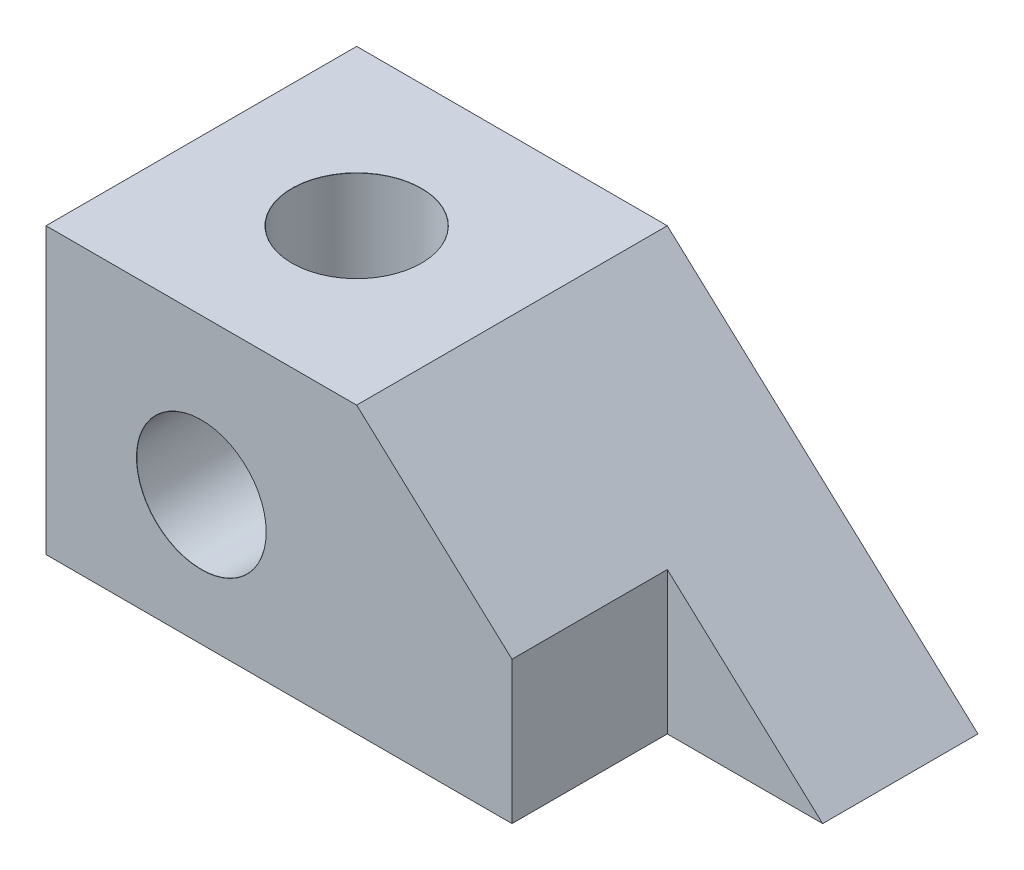
ISO-10303-21;
HEADER;
FILE_DESCRIPTION(('STEP AP214'),'2;1');
FILE_NAME('part.step','',(''),(''),'','','');
FILE_SCHEMA(('AUTOMOTIVE_DESIGN { 1 0 10303 214 1 1 1 1 }'));
ENDSEC;
DATA;
#1=APPLICATION_CONTEXT('core data for automotive mechanical design processes');
#2=APPLICATION_PROTOCOL_DEFINITION('international standard','automotive_design',2000,#1);
#3=PRODUCT_CONTEXT('',#1,'mechanical');
#4=PRODUCT('Part','Part','',(#3));
#5=PRODUCT_RELATED_PRODUCT_CATEGORY('part','',(#4));
#6=PRODUCT_DEFINITION_FORMATION('','',#4);
#7=PRODUCT_DEFINITION_CONTEXT('part definition',#1,'design');
#8=PRODUCT_DEFINITION('design','',#6,#7);
#9=PRODUCT_DEFINITION_SHAPE('','',#8);
#10=(LENGTH_UNIT() NAMED_UNIT(*) SI_UNIT(.MILLI.,.METRE.));
#11=(NAMED_UNIT(*) PLANE_ANGLE_UNIT() SI_UNIT($,.RADIAN.));
#12=(NAMED_UNIT(*) SI_UNIT($,.STERADIAN.) SOLID_ANGLE_UNIT());
#13=UNCERTAINTY_MEASURE_WITH_UNIT(LENGTH_MEASURE(1.E-05),#10,'distance_accuracy_value','');
#14=(GEOMETRIC_REPRESENTATION_CONTEXT(3) GLOBAL_UNCERTAINTY_ASSIGNED_CONTEXT((#13)) GLOBAL_UNIT_ASSIGNED_CONTEXT((#10,
#11,#12)) REPRESENTATION_CONTEXT('',''));
#15=CARTESIAN_POINT('',(0.,0.,0.));
#16=DIRECTION('',(0.,0.,1.));
#17=DIRECTION('',(1.,0.,0.));
#18=AXIS2_PLACEMENT_3D('',#15,#16,#17);
#19=CARTESIAN_POINT('',(30.,25.,0.));
#20=DIRECTION('',(0.,0.,1.));
#21=DIRECTION('',(1.,0.,0.));
#22=AXIS2_PLACEMENT_3D('',#19,#20,#21);
#23=CYLINDRICAL_SURFACE('',#22,12.5);
#24=CARTESIAN_POINT('',(30.,25.,-0.025000000000025));
#25=DIRECTION('',(0.,0.,1.));
#26=DIRECTION('',(1.,0.,0.));
#27=AXIS2_PLACEMENT_3D('',#24,#25,#26);
#28=CIRCLE('',#27,12.5);
#29=CARTESIAN_POINT('',(42.5,25.,-0.025000000000025));
#30=VERTEX_POINT('',#29);
#31=EDGE_CURVE('E244',#30,#30,#28,.T.);
#32=ORIENTED_EDGE('',*,*,#31,.T.);
#33=EDGE_LOOP('',(#32));
#34=FACE_BOUND('',#33,.T.);
#35=CARTESIAN_POINT('',(30.,25.,-30.));
#36=DIRECTION('',(0.,-0.707106781186547,0.707106781186547));
#37=DIRECTION('',(0.,0.707106781186547,0.707106781186547));
#38=AXIS2_PLACEMENT_3D('',#35,#36,#37);
#39=ELLIPSE('',#38,17.6776695296637,12.5);
#40=CARTESIAN_POINT('',(17.5,25.,-30.));
#41=VERTEX_POINT('',#40);
#42=CARTESIAN_POINT('',(42.5,25.,-30.));
#43=VERTEX_POINT('',#42);
#44=EDGE_CURVE('E53',#41,#43,#39,.F.);
#45=ORIENTED_EDGE('',*,*,#44,.T.);
#46=CARTESIAN_POINT('',(30.,25.,-30.));
#47=DIRECTION('',(0.,0.707106781186547,0.707106781186547));
#48=DIRECTION('',(0.,-0.707106781186547,0.707106781186547));
#49=AXIS2_PLACEMENT_3D('',#46,#47,#48);
#50=ELLIPSE('',#49,17.6776695296637,12.5);
#51=EDGE_CURVE('E11',#43,#41,#50,.F.);
#52=ORIENTED_EDGE('',*,*,#51,.T.);
#53=EDGE_LOOP('',(#45,#52));
#54=FACE_BOUND('',#53,.T.);
#55=ADVANCED_FACE('F39',(#34,#54),#23,.F.);
#56=CARTESIAN_POINT('',(0.,55.,0.));
#57=DIRECTION('',(1.,0.,0.));
#58=DIRECTION('',(0.,0.,-1.));
#59=AXIS2_PLACEMENT_3D('',#56,#57,#58);
#60=PLANE('',#59);
#61=DIRECTION('',(0.,0.,1.));
#62=VECTOR('',#61,1.);
#63=CARTESIAN_POINT('',(0.,0.,0.));
#64=LINE('',#63,#62);
#65=CARTESIAN_POINT('',(0.,0.,-60.));
#66=VERTEX_POINT('',#65);
#67=CARTESIAN_POINT('',(0.,0.,0.));
#68=VERTEX_POINT('',#67);
#69=EDGE_CURVE('E103',#66,#68,#64,.T.);
#70=ORIENTED_EDGE('',*,*,#69,.T.);
#71=DIRECTION('',(0.,-1.,0.));
#72=VECTOR('',#71,1.);
#73=CARTESIAN_POINT('',(0.,55.,0.));
#74=LINE('',#73,#72);
#75=CARTESIAN_POINT('',(0.,55.,0.));
#76=VERTEX_POINT('',#75);
#77=EDGE_CURVE('E140',#76,#68,#74,.T.);
#78=ORIENTED_EDGE('',*,*,#77,.F.);
#79=DIRECTION('',(0.,0.,1.));
#80=VECTOR('',#79,1.);
#81=CARTESIAN_POINT('',(0.,55.,0.));
#82=LINE('',#81,#80);
#83=CARTESIAN_POINT('',(0.,55.,-60.));
#84=VERTEX_POINT('',#83);
#85=EDGE_CURVE('E97',#84,#76,#82,.T.);
#86=ORIENTED_EDGE('',*,*,#85,.F.);
#87=DIRECTION('',(0.,-1.,0.));
#88=VECTOR('',#87,1.);
#89=CARTESIAN_POINT('',(0.,55.,-60.));
#90=LINE('',#89,#88);
#91=EDGE_CURVE('E88',#84,#66,#90,.T.);
#92=ORIENTED_EDGE('',*,*,#91,.T.);
#93=EDGE_LOOP('',(#70,#78,#86,#92));
#94=FACE_BOUND('',#93,.T.);
#95=ADVANCED_FACE('F41',(#94),#60,.F.);
#96=CARTESIAN_POINT('',(0.,55.,0.));
#97=DIRECTION('',(0.,0.,-1.));
#98=DIRECTION('',(-1.,0.,0.));
#99=AXIS2_PLACEMENT_3D('',#96,#97,#98);
#100=PLANE('',#99);
#101=CARTESIAN_POINT('',(30.,25.,0.));
#102=DIRECTION('',(0.,0.,1.));
#103=DIRECTION('',(1.,0.,0.));
#104=AXIS2_PLACEMENT_3D('',#101,#102,#103);
#105=CIRCLE('',#104,12.525);
#106=CARTESIAN_POINT('',(42.525,25.,0.));
#107=VERTEX_POINT('',#106);
#108=EDGE_CURVE('E208',#107,#107,#105,.T.);
#109=ORIENTED_EDGE('',*,*,#108,.F.);
#110=EDGE_LOOP('',(#109));
#111=FACE_BOUND('',#110,.T.);
#112=DIRECTION('',(0.,-1.,0.));
#113=VECTOR('',#112,1.);
#114=CARTESIAN_POINT('',(90.,55.,0.));
#115=LINE('',#114,#113);
#116=CARTESIAN_POINT('',(90.,27.5,0.));
#117=VERTEX_POINT('',#116);
#118=CARTESIAN_POINT('',(90.,0.,0.));
#119=VERTEX_POINT('',#118);
#120=EDGE_CURVE('E137',#117,#119,#115,.T.);
#121=ORIENTED_EDGE('',*,*,#120,.F.);
#122=DIRECTION('',(0.737154140200741,-0.675724628517346,0.));
#123=VECTOR('',#122,1.);
#124=CARTESIAN_POINT('',(60.,55.,0.));
#125=LINE('',#124,#123);
#126=CARTESIAN_POINT('',(60.,55.,0.));
#127=VERTEX_POINT('',#126);
#128=EDGE_CURVE('E213',#127,#117,#125,.T.);
#129=ORIENTED_EDGE('',*,*,#128,.F.);
#130=DIRECTION('',(1.,0.,0.));
#131=VECTOR('',#130,1.);
#132=CARTESIAN_POINT('',(0.,55.,0.));
#133=LINE('',#132,#131);
#134=EDGE_CURVE('E229',#76,#127,#133,.T.);
#135=ORIENTED_EDGE('',*,*,#134,.F.);
#136=ORIENTED_EDGE('',*,*,#77,.T.);
#137=DIRECTION('',(1.,0.,0.));
#138=VECTOR('',#137,1.);
#139=CARTESIAN_POINT('',(0.,0.,0.));
#140=LINE('',#139,#138);
#141=EDGE_CURVE('E110',#68,#119,#140,.T.);
#142=ORIENTED_EDGE('',*,*,#141,.T.);
#143=EDGE_LOOP('',(#121,#129,#135,#136,#142));
#144=FACE_BOUND('',#143,.T.);
#145=ADVANCED_FACE('F168',(#111,#144),#100,.F.);
#146=CARTESIAN_POINT('',(90.,55.,0.));
#147=DIRECTION('',(-1.,0.,0.));
#148=DIRECTION('',(0.,0.,1.));
#149=AXIS2_PLACEMENT_3D('',#146,#147,#148);
#150=PLANE('',#149);
#151=DIRECTION('',(0.,-1.,0.));
#152=VECTOR('',#151,1.);
#153=CARTESIAN_POINT('',(90.,55.,-30.));
#154=LINE('',#153,#152);
#155=CARTESIAN_POINT('',(90.,27.5,-30.));
#156=VERTEX_POINT('',#155);
#157=CARTESIAN_POINT('',(90.,0.,-30.));
#158=VERTEX_POINT('',#157);
#159=EDGE_CURVE('E105',#156,#158,#154,.T.);
#160=ORIENTED_EDGE('',*,*,#159,.F.);
#161=DIRECTION('',(0.,0.,1.));
#162=VECTOR('',#161,1.);
#163=CARTESIAN_POINT('',(90.,27.5,0.));
#164=LINE('',#163,#162);
#165=EDGE_CURVE('E113',#156,#117,#164,.T.);
#166=ORIENTED_EDGE('',*,*,#165,.T.);
#167=ORIENTED_EDGE('',*,*,#120,.T.);
#168=DIRECTION('',(0.,0.,-1.));
#169=VECTOR('',#168,1.);
#170=CARTESIAN_POINT('',(90.,0.,0.));
#171=LINE('',#170,#169);
#172=EDGE_CURVE('E117',#119,#158,#171,.T.);
#173=ORIENTED_EDGE('',*,*,#172,.T.);
#174=EDGE_LOOP('',(#160,#166,#167,#173));
#175=FACE_BOUND('',#174,.T.);
#176=ADVANCED_FACE('F197',(#175),#150,.F.);
#177=CARTESIAN_POINT('',(90.,55.,-30.));
#178=DIRECTION('',(0.,0.,-1.));
#179=DIRECTION('',(-1.,0.,0.));
#180=AXIS2_PLACEMENT_3D('',#177,#178,#179);
#181=PLANE('',#180);
#182=DIRECTION('',(1.,0.,0.));
#183=VECTOR('',#182,1.);
#184=CARTESIAN_POINT('',(90.,0.,-30.));
#185=LINE('',#184,#183);
#186=CARTESIAN_POINT('',(120.,0.,-30.));
#187=VERTEX_POINT('',#186);
#188=EDGE_CURVE('E128',#158,#187,#185,.T.);
#189=ORIENTED_EDGE('',*,*,#188,.T.);
#190=DIRECTION('',(-0.737154140200741,0.675724628517346,0.));
#191=VECTOR('',#190,1.);
#192=CARTESIAN_POINT('',(76.3018867924528,40.0566037735849,-30.));
#193=LINE('',#192,#191);
#194=EDGE_CURVE('E120',#187,#156,#193,.T.);
#195=ORIENTED_EDGE('',*,*,#194,.T.);
#196=ORIENTED_EDGE('',*,*,#159,.T.);
#197=EDGE_LOOP('',(#189,#195,#196));
#198=FACE_BOUND('',#197,.T.);
#199=ADVANCED_FACE('F193',(#198),#181,.F.);
#200=CARTESIAN_POINT('',(0.,55.,-60.));
#201=DIRECTION('',(0.,0.,1.));
#202=DIRECTION('',(1.,0.,0.));
#203=AXIS2_PLACEMENT_3D('',#200,#201,#202);
#204=PLANE('',#203);
#205=CARTESIAN_POINT('',(30.,25.,-60.));
#206=DIRECTION('',(0.,0.,1.));
#207=DIRECTION('',(1.,0.,0.));
#208=AXIS2_PLACEMENT_3D('',#205,#206,#207);
#209=CIRCLE('',#208,12.5);
#210=CARTESIAN_POINT('',(42.5,25.,-60.));
#211=VERTEX_POINT('',#210);
#212=EDGE_CURVE('E239',#211,#211,#209,.T.);
#213=ORIENTED_EDGE('',*,*,#212,.T.);
#214=EDGE_LOOP('',(#213));
#215=FACE_BOUND('',#214,.T.);
#216=DIRECTION('',(-1.,0.,0.));
#217=VECTOR('',#216,1.);
#218=CARTESIAN_POINT('',(102.487310380947,55.,-60.));
#219=LINE('',#218,#217);
#220=CARTESIAN_POINT('',(60.,55.,-60.));
#221=VERTEX_POINT('',#220);
#222=EDGE_CURVE('E62',#221,#84,#219,.T.);
#223=ORIENTED_EDGE('',*,*,#222,.F.);
#224=DIRECTION('',(0.737154140200741,-0.675724628517346,0.));
#225=VECTOR('',#224,1.);
#226=CARTESIAN_POINT('',(60.,55.,-60.));
#227=LINE('',#226,#225);
#228=CARTESIAN_POINT('',(120.,0.,-60.));
#229=VERTEX_POINT('',#228);
#230=EDGE_CURVE('E92',#221,#229,#227,.T.);
#231=ORIENTED_EDGE('',*,*,#230,.T.);
#232=DIRECTION('',(-1.,0.,0.));
#233=VECTOR('',#232,1.);
#234=CARTESIAN_POINT('',(0.,0.,-60.));
#235=LINE('',#234,#233);
#236=EDGE_CURVE('E85',#229,#66,#235,.T.);
#237=ORIENTED_EDGE('',*,*,#236,.T.);
#238=ORIENTED_EDGE('',*,*,#91,.F.);
#239=EDGE_LOOP('',(#223,#231,#237,#238));
#240=FACE_BOUND('',#239,.T.);
#241=ADVANCED_FACE('F87',(#215,#240),#204,.F.);
#242=CARTESIAN_POINT('',(0.,55.,0.));
#243=DIRECTION('',(0.,-1.,0.));
#244=DIRECTION('',(0.,0.,-1.));
#245=AXIS2_PLACEMENT_3D('',#242,#243,#244);
#246=PLANE('',#245);
#247=CARTESIAN_POINT('',(30.,55.,-30.));
#248=DIRECTION('',(0.,1.,0.));
#249=DIRECTION('',(0.,0.,1.));
#250=AXIS2_PLACEMENT_3D('',#247,#248,#249);
#251=CIRCLE('',#250,12.525);
#252=CARTESIAN_POINT('',(30.,55.,-17.475));
#253=VERTEX_POINT('',#252);
#254=EDGE_CURVE('E257',#253,#253,#251,.T.);
#255=ORIENTED_EDGE('',*,*,#254,.F.);
#256=EDGE_LOOP('',(#255));
#257=FACE_BOUND('',#256,.T.);
#258=ORIENTED_EDGE('',*,*,#134,.T.);
#259=DIRECTION('',(0.,0.,1.));
#260=VECTOR('',#259,1.);
#261=CARTESIAN_POINT('',(60.,55.,-60.));
#262=LINE('',#261,#260);
#263=EDGE_CURVE('E222',#221,#127,#262,.T.);
#264=ORIENTED_EDGE('',*,*,#263,.F.);
#265=ORIENTED_EDGE('',*,*,#222,.T.);
#266=ORIENTED_EDGE('',*,*,#85,.T.);
#267=EDGE_LOOP('',(#258,#264,#265,#266));
#268=FACE_BOUND('',#267,.T.);
#269=ADVANCED_FACE('F184',(#257,#268),#246,.F.);
#270=CARTESIAN_POINT('',(0.,0.,0.));
#271=DIRECTION('',(0.,-1.,0.));
#272=DIRECTION('',(0.,0.,-1.));
#273=AXIS2_PLACEMENT_3D('',#270,#271,#272);
#274=PLANE('',#273);
#275=CARTESIAN_POINT('',(30.,0.,-30.));
#276=DIRECTION('',(0.,1.,0.));
#277=DIRECTION('',(0.,0.,1.));
#278=AXIS2_PLACEMENT_3D('',#275,#276,#277);
#279=CIRCLE('',#278,12.5);
#280=CARTESIAN_POINT('',(30.,0.,-17.5));
#281=VERTEX_POINT('',#280);
#282=EDGE_CURVE('E249',#281,#281,#279,.T.);
#283=ORIENTED_EDGE('',*,*,#282,.T.);
#284=EDGE_LOOP('',(#283));
#285=FACE_BOUND('',#284,.T.);
#286=ORIENTED_EDGE('',*,*,#69,.F.);
#287=ORIENTED_EDGE('',*,*,#236,.F.);
#288=DIRECTION('',(0.,0.,-1.));
#289=VECTOR('',#288,1.);
#290=CARTESIAN_POINT('',(120.,0.,-60.));
#291=LINE('',#290,#289);
#292=EDGE_CURVE('E98',#187,#229,#291,.T.);
#293=ORIENTED_EDGE('',*,*,#292,.F.);
#294=ORIENTED_EDGE('',*,*,#188,.F.);
#295=ORIENTED_EDGE('',*,*,#172,.F.);
#296=ORIENTED_EDGE('',*,*,#141,.F.);
#297=EDGE_LOOP('',(#286,#287,#293,#294,#295,#296));
#298=FACE_BOUND('',#297,.T.);
#299=ADVANCED_FACE('F107',(#285,#298),#274,.T.);
#300=CARTESIAN_POINT('',(60.,55.,-60.));
#301=DIRECTION('',(-0.675724628517346,-0.737154140200741,0.));
#302=DIRECTION('',(0.737154140200741,-0.675724628517346,0.));
#303=AXIS2_PLACEMENT_3D('',#300,#301,#302);
#304=PLANE('',#303);
#305=ORIENTED_EDGE('',*,*,#194,.F.);
#306=ORIENTED_EDGE('',*,*,#292,.T.);
#307=ORIENTED_EDGE('',*,*,#230,.F.);
#308=ORIENTED_EDGE('',*,*,#263,.T.);
#309=ORIENTED_EDGE('',*,*,#128,.T.);
#310=ORIENTED_EDGE('',*,*,#165,.F.);
#311=EDGE_LOOP('',(#305,#306,#307,#308,#309,#310));
#312=FACE_BOUND('',#311,.T.);
#313=ADVANCED_FACE('F174',(#312),#304,.F.);
#314=CARTESIAN_POINT('',(30.,25.,-30.));
#315=DIRECTION('',(0.,-0.707106781186547,0.707106781186547));
#316=DIRECTION('',(0.,0.707106781186547,0.707106781186547));
#317=AXIS2_PLACEMENT_3D('',#314,#315,#316);
#318=ELLIPSE('',#317,17.6776695296637,12.5);
#319=EDGE_CURVE('E145',#41,#43,#318,.T.);
#320=ORIENTED_EDGE('',*,*,#319,.T.);
#321=CARTESIAN_POINT('',(30.,25.,-30.));
#322=DIRECTION('',(0.,0.707106781186547,0.707106781186547));
#323=DIRECTION('',(0.,-0.707106781186547,0.707106781186547));
#324=AXIS2_PLACEMENT_3D('',#321,#322,#323);
#325=ELLIPSE('',#324,17.6776695296637,12.5);
#326=EDGE_CURVE('E48',#43,#41,#325,.T.);
#327=ORIENTED_EDGE('',*,*,#326,.T.);
#328=EDGE_LOOP('',(#320,#327));
#329=FACE_BOUND('',#328,.T.);
#330=ORIENTED_EDGE('',*,*,#212,.F.);
#331=EDGE_LOOP('',(#330));
#332=FACE_BOUND('',#331,.T.);
#333=ADVANCED_FACE('F152',(#329,#332),#23,.F.);
#334=CARTESIAN_POINT('',(30.,25.,0.));
#335=DIRECTION('',(0.,0.,1.));
#336=DIRECTION('',(1.,0.,0.));
#337=AXIS2_PLACEMENT_3D('',#334,#335,#336);
#338=CONICAL_SURFACE('',#337,12.525,0.785398163397171);
#339=ORIENTED_EDGE('',*,*,#31,.F.);
#340=EDGE_LOOP('',(#339));
#341=FACE_BOUND('',#340,.T.);
#342=ORIENTED_EDGE('',*,*,#108,.T.);
#343=EDGE_LOOP('',(#342));
#344=FACE_BOUND('',#343,.T.);
#345=ADVANCED_FACE('F173',(#341,#344),#338,.F.);
#346=CARTESIAN_POINT('',(30.,55.,-30.));
#347=DIRECTION('',(0.,1.,0.));
#348=DIRECTION('',(0.,0.,1.));
#349=AXIS2_PLACEMENT_3D('',#346,#347,#348);
#350=CYLINDRICAL_SURFACE('',#349,12.5);
#351=CARTESIAN_POINT('',(30.,54.975,-30.));
#352=DIRECTION('',(0.,1.,0.));
#353=DIRECTION('',(0.,0.,1.));
#354=AXIS2_PLACEMENT_3D('',#351,#352,#353);
#355=CIRCLE('',#354,12.5);
#356=CARTESIAN_POINT('',(30.,54.975,-17.5));
#357=VERTEX_POINT('',#356);
#358=EDGE_CURVE('E253',#357,#357,#355,.T.);
#359=ORIENTED_EDGE('',*,*,#358,.T.);
#360=EDGE_LOOP('',(#359));
#361=FACE_BOUND('',#360,.T.);
#362=ORIENTED_EDGE('',*,*,#44,.F.);
#363=ORIENTED_EDGE('',*,*,#326,.F.);
#364=EDGE_LOOP('',(#362,#363));
#365=FACE_BOUND('',#364,.T.);
#366=ADVANCED_FACE('F159',(#361,#365),#350,.F.);
#367=CARTESIAN_POINT('',(30.,55.,-30.));
#368=DIRECTION('',(0.,1.,0.));
#369=DIRECTION('',(0.,0.,1.));
#370=AXIS2_PLACEMENT_3D('',#367,#368,#369);
#371=CONICAL_SURFACE('',#370,12.525,0.785398163397171);
#372=ORIENTED_EDGE('',*,*,#358,.F.);
#373=EDGE_LOOP('',(#372));
#374=FACE_BOUND('',#373,.T.);
#375=ORIENTED_EDGE('',*,*,#254,.T.);
#376=EDGE_LOOP('',(#375));
#377=FACE_BOUND('',#376,.T.);
#378=ADVANCED_FACE('F262',(#374,#377),#371,.F.);
#379=ORIENTED_EDGE('',*,*,#282,.F.);
#380=EDGE_LOOP('',(#379));
#381=FACE_BOUND('',#380,.T.);
#382=ORIENTED_EDGE('',*,*,#319,.F.);
#383=ORIENTED_EDGE('',*,*,#51,.F.);
#384=EDGE_LOOP('',(#382,#383));
#385=FACE_BOUND('',#384,.T.);
#386=ADVANCED_FACE('F161',(#381,#385),#350,.F.);
#387=CLOSED_SHELL('',(#55,#95,#145,#176,#199,#241,#269,#299,#313,#333,#345,#366,#378,#386));
#388=MANIFOLD_SOLID_BREP('B2',#387);
#389=ADVANCED_BREP_SHAPE_REPRESENTATION('',(#18,#388),#14);
#390=SHAPE_DEFINITION_REPRESENTATION(#9,#389);
ENDSEC;
END-ISO-10303-21;
